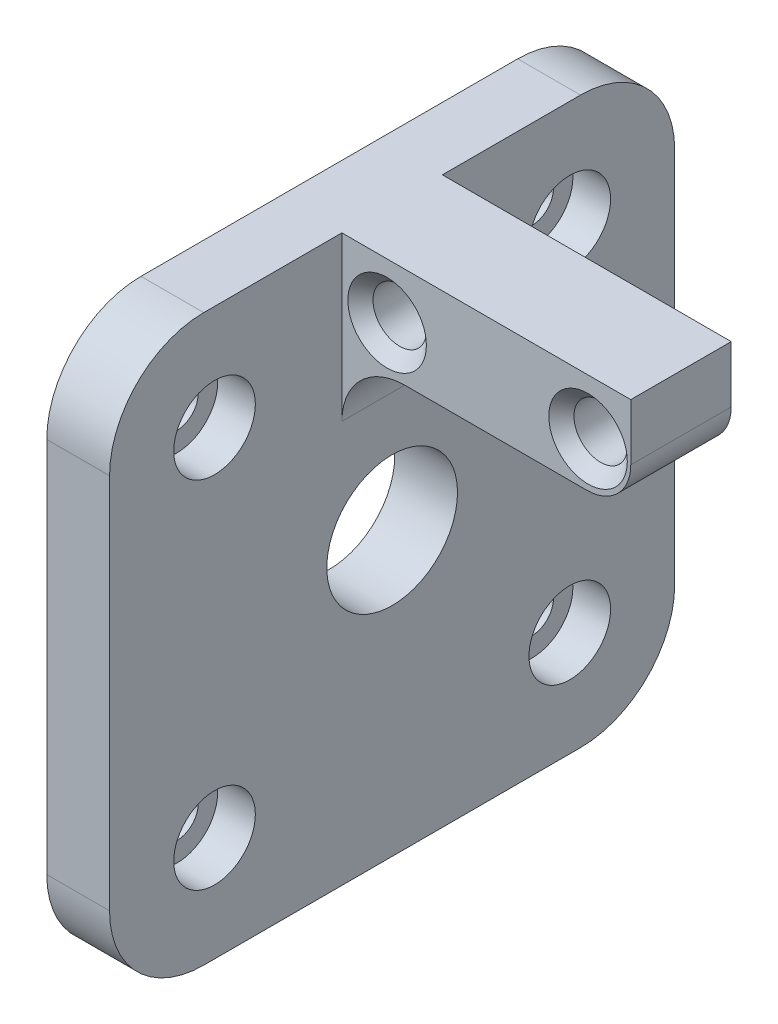
ISO-10303-21;
HEADER;
FILE_DESCRIPTION(('STEP AP214'),'2;1');
FILE_NAME('part.step','',(''),(''),'','','');
FILE_SCHEMA(('AUTOMOTIVE_DESIGN { 1 0 10303 214 1 1 1 1 }'));
ENDSEC;
DATA;
#1=APPLICATION_CONTEXT('core data for automotive mechanical design processes');
#2=APPLICATION_PROTOCOL_DEFINITION('international standard','automotive_design',2000,#1);
#3=PRODUCT_CONTEXT('',#1,'mechanical');
#4=PRODUCT('Part','Part','',(#3));
#5=PRODUCT_RELATED_PRODUCT_CATEGORY('part','',(#4));
#6=PRODUCT_DEFINITION_FORMATION('','',#4);
#7=PRODUCT_DEFINITION_CONTEXT('part definition',#1,'design');
#8=PRODUCT_DEFINITION('design','',#6,#7);
#9=PRODUCT_DEFINITION_SHAPE('','',#8);
#10=(LENGTH_UNIT() NAMED_UNIT(*) SI_UNIT(.MILLI.,.METRE.));
#11=(NAMED_UNIT(*) PLANE_ANGLE_UNIT() SI_UNIT($,.RADIAN.));
#12=(NAMED_UNIT(*) SI_UNIT($,.STERADIAN.) SOLID_ANGLE_UNIT());
#13=UNCERTAINTY_MEASURE_WITH_UNIT(LENGTH_MEASURE(1.E-05),#10,'distance_accuracy_value','');
#14=(GEOMETRIC_REPRESENTATION_CONTEXT(3) GLOBAL_UNCERTAINTY_ASSIGNED_CONTEXT((#13)) GLOBAL_UNIT_ASSIGNED_CONTEXT((#10,
#11,#12)) REPRESENTATION_CONTEXT('',''));
#15=CARTESIAN_POINT('',(0.,0.,0.));
#16=DIRECTION('',(0.,0.,1.));
#17=DIRECTION('',(1.,0.,0.));
#18=AXIS2_PLACEMENT_3D('',#15,#16,#17);
#19=CARTESIAN_POINT('',(5.,22.5,0.));
#20=DIRECTION('',(0.,1.,0.));
#21=DIRECTION('',(0.,0.,1.));
#22=AXIS2_PLACEMENT_3D('',#19,#20,#21);
#23=PLANE('',#22);
#24=DIRECTION('',(0.,0.,-1.));
#25=VECTOR('',#24,1.);
#26=CARTESIAN_POINT('',(5.,22.5,0.));
#27=LINE('',#26,#25);
#28=CARTESIAN_POINT('',(5.,22.5,-4.));
#29=VERTEX_POINT('',#28);
#30=CARTESIAN_POINT('',(5.,22.5,-15.));
#31=VERTEX_POINT('',#30);
#32=EDGE_CURVE('E222',#29,#31,#27,.T.);
#33=ORIENTED_EDGE('',*,*,#32,.T.);
#34=DIRECTION('',(-1.,0.,0.));
#35=VECTOR('',#34,1.);
#36=CARTESIAN_POINT('',(0.,22.5,-15.));
#37=LINE('',#36,#35);
#38=CARTESIAN_POINT('',(0.,22.5,-15.));
#39=VERTEX_POINT('',#38);
#40=EDGE_CURVE('E305',#31,#39,#37,.T.);
#41=ORIENTED_EDGE('',*,*,#40,.T.);
#42=DIRECTION('',(0.,0.,-1.));
#43=VECTOR('',#42,1.);
#44=CARTESIAN_POINT('',(0.,22.5,0.));
#45=LINE('',#44,#43);
#46=CARTESIAN_POINT('',(0.,22.5,15.));
#47=VERTEX_POINT('',#46);
#48=EDGE_CURVE('E217',#47,#39,#45,.T.);
#49=ORIENTED_EDGE('',*,*,#48,.F.);
#50=DIRECTION('',(-1.,0.,0.));
#51=VECTOR('',#50,1.);
#52=CARTESIAN_POINT('',(5.,22.5,15.));
#53=LINE('',#52,#51);
#54=CARTESIAN_POINT('',(5.,22.5,15.));
#55=VERTEX_POINT('',#54);
#56=EDGE_CURVE('E302',#47,#55,#53,.F.);
#57=ORIENTED_EDGE('',*,*,#56,.T.);
#58=CARTESIAN_POINT('',(5.,22.5,4.));
#59=VERTEX_POINT('',#58);
#60=EDGE_CURVE('E218',#55,#59,#27,.T.);
#61=ORIENTED_EDGE('',*,*,#60,.T.);
#62=DIRECTION('',(-1.,0.,0.));
#63=VECTOR('',#62,1.);
#64=CARTESIAN_POINT('',(28.,22.5,4.));
#65=LINE('',#64,#63);
#66=CARTESIAN_POINT('',(28.,22.5,4.));
#67=VERTEX_POINT('',#66);
#68=EDGE_CURVE('E182',#67,#59,#65,.T.);
#69=ORIENTED_EDGE('',*,*,#68,.F.);
#70=DIRECTION('',(0.,0.,-1.));
#71=VECTOR('',#70,1.);
#72=CARTESIAN_POINT('',(28.,22.5,0.));
#73=LINE('',#72,#71);
#74=CARTESIAN_POINT('',(28.,22.5,-4.));
#75=VERTEX_POINT('',#74);
#76=EDGE_CURVE('E189',#67,#75,#73,.T.);
#77=ORIENTED_EDGE('',*,*,#76,.T.);
#78=DIRECTION('',(-1.,0.,0.));
#79=VECTOR('',#78,1.);
#80=CARTESIAN_POINT('',(28.,22.5,-4.));
#81=LINE('',#80,#79);
#82=EDGE_CURVE('E170',#75,#29,#81,.T.);
#83=ORIENTED_EDGE('',*,*,#82,.T.);
#84=EDGE_LOOP('',(#33,#41,#49,#57,#61,#69,#77,#83));
#85=FACE_BOUND('',#84,.T.);
#86=ADVANCED_FACE('F51',(#85),#23,.T.);
#87=CARTESIAN_POINT('',(5.,0.,22.5));
#88=DIRECTION('',(0.,0.,1.));
#89=DIRECTION('',(1.,0.,0.));
#90=AXIS2_PLACEMENT_3D('',#87,#88,#89);
#91=PLANE('',#90);
#92=DIRECTION('',(0.,1.,0.));
#93=VECTOR('',#92,1.);
#94=CARTESIAN_POINT('',(0.,0.,22.5));
#95=LINE('',#94,#93);
#96=CARTESIAN_POINT('',(0.,-15.,22.5));
#97=VERTEX_POINT('',#96);
#98=CARTESIAN_POINT('',(0.,15.,22.5));
#99=VERTEX_POINT('',#98);
#100=EDGE_CURVE('E242',#97,#99,#95,.T.);
#101=ORIENTED_EDGE('',*,*,#100,.F.);
#102=DIRECTION('',(-1.,0.,0.));
#103=VECTOR('',#102,1.);
#104=CARTESIAN_POINT('',(5.,-15.,22.5));
#105=LINE('',#104,#103);
#106=CARTESIAN_POINT('',(5.,-15.,22.5));
#107=VERTEX_POINT('',#106);
#108=EDGE_CURVE('E280',#97,#107,#105,.F.);
#109=ORIENTED_EDGE('',*,*,#108,.T.);
#110=DIRECTION('',(0.,1.,0.));
#111=VECTOR('',#110,1.);
#112=CARTESIAN_POINT('',(5.,0.,22.5));
#113=LINE('',#112,#111);
#114=CARTESIAN_POINT('',(5.,15.,22.5));
#115=VERTEX_POINT('',#114);
#116=EDGE_CURVE('E221',#107,#115,#113,.T.);
#117=ORIENTED_EDGE('',*,*,#116,.T.);
#118=DIRECTION('',(-1.,0.,0.));
#119=VECTOR('',#118,1.);
#120=CARTESIAN_POINT('',(5.,15.,22.5));
#121=LINE('',#120,#119);
#122=EDGE_CURVE('E276',#115,#99,#121,.T.);
#123=ORIENTED_EDGE('',*,*,#122,.T.);
#124=EDGE_LOOP('',(#101,#109,#117,#123));
#125=FACE_BOUND('',#124,.T.);
#126=ADVANCED_FACE('F380',(#125),#91,.T.);
#127=CARTESIAN_POINT('',(5.,-22.5,0.));
#128=DIRECTION('',(0.,1.,0.));
#129=DIRECTION('',(0.,0.,1.));
#130=AXIS2_PLACEMENT_3D('',#127,#128,#129);
#131=PLANE('',#130);
#132=DIRECTION('',(0.,0.,-1.));
#133=VECTOR('',#132,1.);
#134=CARTESIAN_POINT('',(5.,-22.5,0.));
#135=LINE('',#134,#133);
#136=CARTESIAN_POINT('',(5.,-22.5,15.));
#137=VERTEX_POINT('',#136);
#138=CARTESIAN_POINT('',(5.,-22.5,-15.));
#139=VERTEX_POINT('',#138);
#140=EDGE_CURVE('E226',#137,#139,#135,.T.);
#141=ORIENTED_EDGE('',*,*,#140,.F.);
#142=DIRECTION('',(-1.,0.,0.));
#143=VECTOR('',#142,1.);
#144=CARTESIAN_POINT('',(0.,-22.5,15.));
#145=LINE('',#144,#143);
#146=CARTESIAN_POINT('',(0.,-22.5,15.));
#147=VERTEX_POINT('',#146);
#148=EDGE_CURVE('E260',#137,#147,#145,.T.);
#149=ORIENTED_EDGE('',*,*,#148,.T.);
#150=DIRECTION('',(0.,0.,-1.));
#151=VECTOR('',#150,1.);
#152=CARTESIAN_POINT('',(0.,-22.5,0.));
#153=LINE('',#152,#151);
#154=CARTESIAN_POINT('',(0.,-22.5,-15.));
#155=VERTEX_POINT('',#154);
#156=EDGE_CURVE('E246',#147,#155,#153,.T.);
#157=ORIENTED_EDGE('',*,*,#156,.T.);
#158=DIRECTION('',(-1.,0.,0.));
#159=VECTOR('',#158,1.);
#160=CARTESIAN_POINT('',(5.,-22.5,-15.));
#161=LINE('',#160,#159);
#162=EDGE_CURVE('E238',#155,#139,#161,.F.);
#163=ORIENTED_EDGE('',*,*,#162,.T.);
#164=EDGE_LOOP('',(#141,#149,#157,#163));
#165=FACE_BOUND('',#164,.T.);
#166=ADVANCED_FACE('F385',(#165),#131,.F.);
#167=CARTESIAN_POINT('',(5.,0.,-22.5));
#168=DIRECTION('',(0.,0.,1.));
#169=DIRECTION('',(1.,0.,0.));
#170=AXIS2_PLACEMENT_3D('',#167,#168,#169);
#171=PLANE('',#170);
#172=DIRECTION('',(0.,1.,0.));
#173=VECTOR('',#172,1.);
#174=CARTESIAN_POINT('',(5.,0.,-22.5));
#175=LINE('',#174,#173);
#176=CARTESIAN_POINT('',(5.,-15.,-22.5));
#177=VERTEX_POINT('',#176);
#178=CARTESIAN_POINT('',(5.,15.,-22.5));
#179=VERTEX_POINT('',#178);
#180=EDGE_CURVE('E230',#177,#179,#175,.T.);
#181=ORIENTED_EDGE('',*,*,#180,.F.);
#182=DIRECTION('',(-1.,0.,0.));
#183=VECTOR('',#182,1.);
#184=CARTESIAN_POINT('',(5.,-15.,-22.5));
#185=LINE('',#184,#183);
#186=CARTESIAN_POINT('',(0.,-15.,-22.5));
#187=VERTEX_POINT('',#186);
#188=EDGE_CURVE('E298',#177,#187,#185,.T.);
#189=ORIENTED_EDGE('',*,*,#188,.T.);
#190=DIRECTION('',(0.,1.,0.));
#191=VECTOR('',#190,1.);
#192=CARTESIAN_POINT('',(0.,0.,-22.5));
#193=LINE('',#192,#191);
#194=CARTESIAN_POINT('',(0.,15.,-22.5));
#195=VERTEX_POINT('',#194);
#196=EDGE_CURVE('E250',#187,#195,#193,.T.);
#197=ORIENTED_EDGE('',*,*,#196,.T.);
#198=DIRECTION('',(-1.,0.,0.));
#199=VECTOR('',#198,1.);
#200=CARTESIAN_POINT('',(5.,15.,-22.5));
#201=LINE('',#200,#199);
#202=EDGE_CURVE('E295',#195,#179,#201,.F.);
#203=ORIENTED_EDGE('',*,*,#202,.T.);
#204=EDGE_LOOP('',(#181,#189,#197,#203));
#205=FACE_BOUND('',#204,.T.);
#206=ADVANCED_FACE('F426',(#205),#171,.F.);
#207=CARTESIAN_POINT('',(5.,0.,0.));
#208=DIRECTION('',(-1.,0.,0.));
#209=DIRECTION('',(0.,0.,1.));
#210=AXIS2_PLACEMENT_3D('',#207,#208,#209);
#211=CYLINDRICAL_SURFACE('',#210,5.205);
#212=CARTESIAN_POINT('',(5.,0.,0.));
#213=DIRECTION('',(1.,0.,0.));
#214=DIRECTION('',(0.,0.,-1.));
#215=AXIS2_PLACEMENT_3D('',#212,#213,#214);
#216=CIRCLE('',#215,5.205);
#217=CARTESIAN_POINT('',(5.,0.,-5.205));
#218=VERTEX_POINT('',#217);
#219=EDGE_CURVE('E234',#218,#218,#216,.T.);
#220=ORIENTED_EDGE('',*,*,#219,.T.);
#221=EDGE_LOOP('',(#220));
#222=FACE_BOUND('',#221,.T.);
#223=CARTESIAN_POINT('',(0.,0.,0.));
#224=DIRECTION('',(1.,0.,0.));
#225=DIRECTION('',(0.,0.,-1.));
#226=AXIS2_PLACEMENT_3D('',#223,#224,#225);
#227=CIRCLE('',#226,5.205);
#228=CARTESIAN_POINT('',(0.,0.,-5.205));
#229=VERTEX_POINT('',#228);
#230=EDGE_CURVE('E254',#229,#229,#227,.T.);
#231=ORIENTED_EDGE('',*,*,#230,.F.);
#232=EDGE_LOOP('',(#231));
#233=FACE_BOUND('',#232,.T.);
#234=ADVANCED_FACE('F440',(#222,#233),#211,.F.);
#235=CARTESIAN_POINT('',(5.,0.,0.));
#236=DIRECTION('',(1.,0.,0.));
#237=DIRECTION('',(0.,0.,-1.));
#238=AXIS2_PLACEMENT_3D('',#235,#236,#237);
#239=PLANE('',#238);
#240=CARTESIAN_POINT('',(5.,14.142135623731,14.142135623731));
#241=DIRECTION('',(1.,0.,0.));
#242=DIRECTION('',(0.,0.,-1.));
#243=AXIS2_PLACEMENT_3D('',#240,#241,#242);
#244=CIRCLE('',#243,3.25);
#245=CARTESIAN_POINT('',(5.,14.142135623731,10.892135623731));
#246=VERTEX_POINT('',#245);
#247=EDGE_CURVE('E766',#246,#246,#244,.T.);
#248=ORIENTED_EDGE('',*,*,#247,.F.);
#249=EDGE_LOOP('',(#248));
#250=FACE_BOUND('',#249,.T.);
#251=CARTESIAN_POINT('',(5.,14.142135623731,-14.142135623731));
#252=DIRECTION('',(1.,0.,0.));
#253=DIRECTION('',(0.,0.,-1.));
#254=AXIS2_PLACEMENT_3D('',#251,#252,#253);
#255=CIRCLE('',#254,3.25);
#256=CARTESIAN_POINT('',(5.,14.142135623731,-17.392135623731));
#257=VERTEX_POINT('',#256);
#258=EDGE_CURVE('E750',#257,#257,#255,.T.);
#259=ORIENTED_EDGE('',*,*,#258,.F.);
#260=EDGE_LOOP('',(#259));
#261=FACE_BOUND('',#260,.T.);
#262=CARTESIAN_POINT('',(5.,-14.142135623731,14.142135623731));
#263=DIRECTION('',(1.,0.,0.));
#264=DIRECTION('',(0.,0.,-1.));
#265=AXIS2_PLACEMENT_3D('',#262,#263,#264);
#266=CIRCLE('',#265,3.25);
#267=CARTESIAN_POINT('',(5.,-14.142135623731,10.892135623731));
#268=VERTEX_POINT('',#267);
#269=EDGE_CURVE('E734',#268,#268,#266,.T.);
#270=ORIENTED_EDGE('',*,*,#269,.F.);
#271=EDGE_LOOP('',(#270));
#272=FACE_BOUND('',#271,.T.);
#273=CARTESIAN_POINT('',(5.,-14.142135623731,-14.142135623731));
#274=DIRECTION('',(1.,0.,0.));
#275=DIRECTION('',(0.,0.,-1.));
#276=AXIS2_PLACEMENT_3D('',#273,#274,#275);
#277=CIRCLE('',#276,3.25);
#278=CARTESIAN_POINT('',(5.,-14.142135623731,-17.392135623731));
#279=VERTEX_POINT('',#278);
#280=EDGE_CURVE('E718',#279,#279,#277,.T.);
#281=ORIENTED_EDGE('',*,*,#280,.F.);
#282=EDGE_LOOP('',(#281));
#283=FACE_BOUND('',#282,.T.);
#284=DIRECTION('',(0.,0.,1.));
#285=VECTOR('',#284,1.);
#286=CARTESIAN_POINT('',(5.,9.5,0.));
#287=LINE('',#286,#285);
#288=CARTESIAN_POINT('',(5.,9.5,-4.));
#289=VERTEX_POINT('',#288);
#290=CARTESIAN_POINT('',(5.,9.5,4.));
#291=VERTEX_POINT('',#290);
#292=EDGE_CURVE('E309',#289,#291,#287,.T.);
#293=ORIENTED_EDGE('',*,*,#292,.T.);
#294=DIRECTION('',(0.,1.,0.));
#295=VECTOR('',#294,1.);
#296=CARTESIAN_POINT('',(5.,0.,4.00000000000001));
#297=LINE('',#296,#295);
#298=EDGE_CURVE('E181',#291,#59,#297,.T.);
#299=ORIENTED_EDGE('',*,*,#298,.T.);
#300=ORIENTED_EDGE('',*,*,#60,.F.);
#301=CARTESIAN_POINT('',(5.,15.,15.));
#302=DIRECTION('',(1.,0.,0.));
#303=DIRECTION('',(0.,0.,-1.));
#304=AXIS2_PLACEMENT_3D('',#301,#302,#303);
#305=CIRCLE('',#304,7.5);
#306=EDGE_CURVE('E283',#55,#115,#305,.T.);
#307=ORIENTED_EDGE('',*,*,#306,.T.);
#308=ORIENTED_EDGE('',*,*,#116,.F.);
#309=CARTESIAN_POINT('',(5.,-15.,15.));
#310=DIRECTION('',(1.,0.,0.));
#311=DIRECTION('',(0.,0.,-1.));
#312=AXIS2_PLACEMENT_3D('',#309,#310,#311);
#313=CIRCLE('',#312,7.5);
#314=EDGE_CURVE('E292',#107,#137,#313,.T.);
#315=ORIENTED_EDGE('',*,*,#314,.T.);
#316=ORIENTED_EDGE('',*,*,#140,.T.);
#317=CARTESIAN_POINT('',(5.,-15.,-15.));
#318=DIRECTION('',(1.,0.,0.));
#319=DIRECTION('',(0.,0.,-1.));
#320=AXIS2_PLACEMENT_3D('',#317,#318,#319);
#321=CIRCLE('',#320,7.5);
#322=EDGE_CURVE('E289',#139,#177,#321,.T.);
#323=ORIENTED_EDGE('',*,*,#322,.T.);
#324=ORIENTED_EDGE('',*,*,#180,.T.);
#325=CARTESIAN_POINT('',(5.,15.,-15.));
#326=DIRECTION('',(1.,0.,0.));
#327=DIRECTION('',(0.,0.,-1.));
#328=AXIS2_PLACEMENT_3D('',#325,#326,#327);
#329=CIRCLE('',#328,7.5);
#330=EDGE_CURVE('E286',#179,#31,#329,.T.);
#331=ORIENTED_EDGE('',*,*,#330,.T.);
#332=ORIENTED_EDGE('',*,*,#32,.F.);
#333=DIRECTION('',(0.,1.,0.));
#334=VECTOR('',#333,1.);
#335=CARTESIAN_POINT('',(5.,0.,-4.00000000000001));
#336=LINE('',#335,#334);
#337=EDGE_CURVE('E175',#289,#29,#336,.T.);
#338=ORIENTED_EDGE('',*,*,#337,.F.);
#339=EDGE_LOOP('',(#293,#299,#300,#307,#308,#315,#316,#323,#324,#331,#332,#338));
#340=FACE_BOUND('',#339,.T.);
#341=ORIENTED_EDGE('',*,*,#219,.F.);
#342=EDGE_LOOP('',(#341));
#343=FACE_BOUND('',#342,.T.);
#344=ADVANCED_FACE('F411',(#250,#261,#272,#283,#340,#343),#239,.T.);
#345=CARTESIAN_POINT('',(0.,0.,0.));
#346=DIRECTION('',(1.,0.,0.));
#347=DIRECTION('',(0.,0.,-1.));
#348=AXIS2_PLACEMENT_3D('',#345,#346,#347);
#349=PLANE('',#348);
#350=CARTESIAN_POINT('',(0.,14.142135623731,14.142135623731));
#351=DIRECTION('',(1.,0.,0.));
#352=DIRECTION('',(0.,0.,-1.));
#353=AXIS2_PLACEMENT_3D('',#350,#351,#352);
#354=CIRCLE('',#353,1.7);
#355=CARTESIAN_POINT('',(0.,14.142135623731,12.442135623731));
#356=VERTEX_POINT('',#355);
#357=EDGE_CURVE('E754',#356,#356,#354,.T.);
#358=ORIENTED_EDGE('',*,*,#357,.T.);
#359=EDGE_LOOP('',(#358));
#360=FACE_BOUND('',#359,.T.);
#361=CARTESIAN_POINT('',(0.,14.142135623731,-14.142135623731));
#362=DIRECTION('',(1.,0.,0.));
#363=DIRECTION('',(0.,0.,-1.));
#364=AXIS2_PLACEMENT_3D('',#361,#362,#363);
#365=CIRCLE('',#364,1.7);
#366=CARTESIAN_POINT('',(0.,14.142135623731,-15.842135623731));
#367=VERTEX_POINT('',#366);
#368=EDGE_CURVE('E738',#367,#367,#365,.T.);
#369=ORIENTED_EDGE('',*,*,#368,.T.);
#370=EDGE_LOOP('',(#369));
#371=FACE_BOUND('',#370,.T.);
#372=CARTESIAN_POINT('',(0.,-14.142135623731,14.142135623731));
#373=DIRECTION('',(1.,0.,0.));
#374=DIRECTION('',(0.,0.,-1.));
#375=AXIS2_PLACEMENT_3D('',#372,#373,#374);
#376=CIRCLE('',#375,1.7);
#377=CARTESIAN_POINT('',(0.,-14.142135623731,12.442135623731));
#378=VERTEX_POINT('',#377);
#379=EDGE_CURVE('E722',#378,#378,#376,.T.);
#380=ORIENTED_EDGE('',*,*,#379,.T.);
#381=EDGE_LOOP('',(#380));
#382=FACE_BOUND('',#381,.T.);
#383=CARTESIAN_POINT('',(0.,-14.142135623731,-14.142135623731));
#384=DIRECTION('',(1.,0.,0.));
#385=DIRECTION('',(0.,0.,-1.));
#386=AXIS2_PLACEMENT_3D('',#383,#384,#385);
#387=CIRCLE('',#386,1.7);
#388=CARTESIAN_POINT('',(0.,-14.142135623731,-15.8421356237309));
#389=VERTEX_POINT('',#388);
#390=EDGE_CURVE('E704',#389,#389,#387,.T.);
#391=ORIENTED_EDGE('',*,*,#390,.T.);
#392=EDGE_LOOP('',(#391));
#393=FACE_BOUND('',#392,.T.);
#394=ORIENTED_EDGE('',*,*,#156,.F.);
#395=CARTESIAN_POINT('',(0.,-15.,15.));
#396=DIRECTION('',(1.,0.,0.));
#397=DIRECTION('',(0.,0.,-1.));
#398=AXIS2_PLACEMENT_3D('',#395,#396,#397);
#399=CIRCLE('',#398,7.5);
#400=EDGE_CURVE('E273',#147,#97,#399,.F.);
#401=ORIENTED_EDGE('',*,*,#400,.T.);
#402=ORIENTED_EDGE('',*,*,#100,.T.);
#403=CARTESIAN_POINT('',(0.,15.,15.));
#404=DIRECTION('',(1.,0.,0.));
#405=DIRECTION('',(0.,0.,-1.));
#406=AXIS2_PLACEMENT_3D('',#403,#404,#405);
#407=CIRCLE('',#406,7.5);
#408=EDGE_CURVE('E264',#99,#47,#407,.F.);
#409=ORIENTED_EDGE('',*,*,#408,.T.);
#410=ORIENTED_EDGE('',*,*,#48,.T.);
#411=CARTESIAN_POINT('',(0.,15.,-15.));
#412=DIRECTION('',(1.,0.,0.));
#413=DIRECTION('',(0.,0.,-1.));
#414=AXIS2_PLACEMENT_3D('',#411,#412,#413);
#415=CIRCLE('',#414,7.5);
#416=EDGE_CURVE('E267',#39,#195,#415,.F.);
#417=ORIENTED_EDGE('',*,*,#416,.T.);
#418=ORIENTED_EDGE('',*,*,#196,.F.);
#419=CARTESIAN_POINT('',(0.,-15.,-15.));
#420=DIRECTION('',(1.,0.,0.));
#421=DIRECTION('',(0.,0.,-1.));
#422=AXIS2_PLACEMENT_3D('',#419,#420,#421);
#423=CIRCLE('',#422,7.5);
#424=EDGE_CURVE('E270',#187,#155,#423,.F.);
#425=ORIENTED_EDGE('',*,*,#424,.T.);
#426=EDGE_LOOP('',(#394,#401,#402,#409,#410,#417,#418,#425));
#427=FACE_BOUND('',#426,.T.);
#428=ORIENTED_EDGE('',*,*,#230,.T.);
#429=EDGE_LOOP('',(#428));
#430=FACE_BOUND('',#429,.T.);
#431=ADVANCED_FACE('F433',(#360,#371,#382,#393,#427,#430),#349,.F.);
#432=CARTESIAN_POINT('',(28.,0.,-4.00000000000001));
#433=DIRECTION('',(0.,0.,-1.));
#434=DIRECTION('',(0.,1.,0.));
#435=AXIS2_PLACEMENT_3D('',#432,#433,#434);
#436=PLANE('',#435);
#437=CARTESIAN_POINT('',(8.60000000000001,18.1,-4.));
#438=DIRECTION('',(0.,0.,-1.));
#439=DIRECTION('',(0.,1.,0.));
#440=AXIS2_PLACEMENT_3D('',#437,#438,#439);
#441=CIRCLE('',#440,2.125);
#442=CARTESIAN_POINT('',(10.725,18.1,-3.99999999999999));
#443=VERTEX_POINT('',#442);
#444=EDGE_CURVE('E193',#443,#443,#441,.T.);
#445=ORIENTED_EDGE('',*,*,#444,.F.);
#446=EDGE_LOOP('',(#445));
#447=FACE_BOUND('',#446,.T.);
#448=CARTESIAN_POINT('',(24.6,18.1,-4.));
#449=DIRECTION('',(0.,0.,-1.));
#450=DIRECTION('',(0.,1.,0.));
#451=AXIS2_PLACEMENT_3D('',#448,#449,#450);
#452=CIRCLE('',#451,2.125);
#453=CARTESIAN_POINT('',(26.725,18.1,-3.99999999999999));
#454=VERTEX_POINT('',#453);
#455=EDGE_CURVE('E701',#454,#454,#452,.T.);
#456=ORIENTED_EDGE('',*,*,#455,.F.);
#457=EDGE_LOOP('',(#456));
#458=FACE_BOUND('',#457,.T.);
#459=DIRECTION('',(0.,-1.,0.));
#460=VECTOR('',#459,1.);
#461=CARTESIAN_POINT('',(28.,0.,-4.00000000000001));
#462=LINE('',#461,#460);
#463=CARTESIAN_POINT('',(28.,18.,-4.));
#464=VERTEX_POINT('',#463);
#465=EDGE_CURVE('E173',#75,#464,#462,.T.);
#466=ORIENTED_EDGE('',*,*,#465,.T.);
#467=CARTESIAN_POINT('',(24.5,18.,-4.));
#468=DIRECTION('',(0.,0.,-1.));
#469=DIRECTION('',(0.,1.,0.));
#470=AXIS2_PLACEMENT_3D('',#467,#468,#469);
#471=CIRCLE('',#470,3.5);
#472=CARTESIAN_POINT('',(24.5,14.5,-4.));
#473=VERTEX_POINT('',#472);
#474=EDGE_CURVE('E79',#464,#473,#471,.T.);
#475=ORIENTED_EDGE('',*,*,#474,.T.);
#476=DIRECTION('',(-1.,0.,0.));
#477=VECTOR('',#476,1.);
#478=CARTESIAN_POINT('',(28.,14.5,-4.));
#479=LINE('',#478,#477);
#480=CARTESIAN_POINT('',(9.99999999999999,14.5,-4.));
#481=VERTEX_POINT('',#480);
#482=EDGE_CURVE('E201',#473,#481,#479,.T.);
#483=ORIENTED_EDGE('',*,*,#482,.T.);
#484=CARTESIAN_POINT('',(10.,9.5,-4.));
#485=DIRECTION('',(0.,0.,-1.));
#486=DIRECTION('',(0.,1.,0.));
#487=AXIS2_PLACEMENT_3D('',#484,#485,#486);
#488=CIRCLE('',#487,5.);
#489=EDGE_CURVE('E321',#481,#289,#488,.F.);
#490=ORIENTED_EDGE('',*,*,#489,.T.);
#491=ORIENTED_EDGE('',*,*,#337,.T.);
#492=ORIENTED_EDGE('',*,*,#82,.F.);
#493=EDGE_LOOP('',(#466,#475,#483,#490,#491,#492));
#494=FACE_BOUND('',#493,.T.);
#495=ADVANCED_FACE('F172',(#447,#458,#494),#436,.T.);
#496=CARTESIAN_POINT('',(28.,0.,4.00000000000001));
#497=DIRECTION('',(0.,0.,-1.));
#498=DIRECTION('',(0.,1.,0.));
#499=AXIS2_PLACEMENT_3D('',#496,#497,#498);
#500=PLANE('',#499);
#501=CARTESIAN_POINT('',(24.6,18.1,4.));
#502=DIRECTION('',(0.,0.,-1.));
#503=DIRECTION('',(0.,1.,0.));
#504=AXIS2_PLACEMENT_3D('',#501,#502,#503);
#505=CIRCLE('',#504,3.12499999999996);
#506=CARTESIAN_POINT('',(24.6,21.2249999999999,4.));
#507=VERTEX_POINT('',#506);
#508=EDGE_CURVE('E337',#507,#507,#505,.T.);
#509=ORIENTED_EDGE('',*,*,#508,.T.);
#510=EDGE_LOOP('',(#509));
#511=FACE_BOUND('',#510,.T.);
#512=CARTESIAN_POINT('',(8.60000000000001,18.1,4.));
#513=DIRECTION('',(0.,0.,-1.));
#514=DIRECTION('',(0.,1.,0.));
#515=AXIS2_PLACEMENT_3D('',#512,#513,#514);
#516=CIRCLE('',#515,3.12499999999996);
#517=CARTESIAN_POINT('',(8.60000000000001,21.225,4.));
#518=VERTEX_POINT('',#517);
#519=EDGE_CURVE('E333',#518,#518,#516,.T.);
#520=ORIENTED_EDGE('',*,*,#519,.T.);
#521=EDGE_LOOP('',(#520));
#522=FACE_BOUND('',#521,.T.);
#523=DIRECTION('',(-1.,0.,0.));
#524=VECTOR('',#523,1.);
#525=CARTESIAN_POINT('',(28.,14.5,4.));
#526=LINE('',#525,#524);
#527=CARTESIAN_POINT('',(24.5,14.5,4.));
#528=VERTEX_POINT('',#527);
#529=CARTESIAN_POINT('',(9.99999999999999,14.5,4.));
#530=VERTEX_POINT('',#529);
#531=EDGE_CURVE('E207',#528,#530,#526,.T.);
#532=ORIENTED_EDGE('',*,*,#531,.F.);
#533=CARTESIAN_POINT('',(24.5,18.,4.));
#534=DIRECTION('',(0.,0.,-1.));
#535=DIRECTION('',(0.,1.,0.));
#536=AXIS2_PLACEMENT_3D('',#533,#534,#535);
#537=CIRCLE('',#536,3.5);
#538=CARTESIAN_POINT('',(28.,18.,4.));
#539=VERTEX_POINT('',#538);
#540=EDGE_CURVE('E330',#528,#539,#537,.F.);
#541=ORIENTED_EDGE('',*,*,#540,.T.);
#542=DIRECTION('',(0.,-1.,0.));
#543=VECTOR('',#542,1.);
#544=CARTESIAN_POINT('',(28.,0.,4.00000000000001));
#545=LINE('',#544,#543);
#546=EDGE_CURVE('E198',#67,#539,#545,.T.);
#547=ORIENTED_EDGE('',*,*,#546,.F.);
#548=ORIENTED_EDGE('',*,*,#68,.T.);
#549=ORIENTED_EDGE('',*,*,#298,.F.);
#550=CARTESIAN_POINT('',(10.,9.5,4.));
#551=DIRECTION('',(0.,0.,-1.));
#552=DIRECTION('',(0.,1.,0.));
#553=AXIS2_PLACEMENT_3D('',#550,#551,#552);
#554=CIRCLE('',#553,5.);
#555=EDGE_CURVE('E317',#291,#530,#554,.T.);
#556=ORIENTED_EDGE('',*,*,#555,.T.);
#557=EDGE_LOOP('',(#532,#541,#547,#548,#549,#556));
#558=FACE_BOUND('',#557,.T.);
#559=ADVANCED_FACE('F353',(#511,#522,#558),#500,.F.);
#560=CARTESIAN_POINT('',(28.,14.5,0.));
#561=DIRECTION('',(0.,1.,0.));
#562=DIRECTION('',(0.,0.,1.));
#563=AXIS2_PLACEMENT_3D('',#560,#561,#562);
#564=PLANE('',#563);
#565=ORIENTED_EDGE('',*,*,#482,.F.);
#566=DIRECTION('',(0.,0.,-1.));
#567=VECTOR('',#566,1.);
#568=CARTESIAN_POINT('',(24.5,14.5,4.));
#569=LINE('',#568,#567);
#570=EDGE_CURVE('E71',#473,#528,#569,.F.);
#571=ORIENTED_EDGE('',*,*,#570,.T.);
#572=ORIENTED_EDGE('',*,*,#531,.T.);
#573=DIRECTION('',(0.,0.,1.));
#574=VECTOR('',#573,1.);
#575=CARTESIAN_POINT('',(9.99999999999999,14.5,0.));
#576=LINE('',#575,#574);
#577=EDGE_CURVE('E313',#530,#481,#576,.F.);
#578=ORIENTED_EDGE('',*,*,#577,.T.);
#579=EDGE_LOOP('',(#565,#571,#572,#578));
#580=FACE_BOUND('',#579,.T.);
#581=ADVANCED_FACE('F356',(#580),#564,.F.);
#582=CARTESIAN_POINT('',(28.,0.,0.));
#583=DIRECTION('',(1.,0.,0.));
#584=DIRECTION('',(0.,0.,-1.));
#585=AXIS2_PLACEMENT_3D('',#582,#583,#584);
#586=PLANE('',#585);
#587=ORIENTED_EDGE('',*,*,#546,.T.);
#588=DIRECTION('',(0.,0.,-1.));
#589=VECTOR('',#588,1.);
#590=CARTESIAN_POINT('',(28.,18.,-4.));
#591=LINE('',#590,#589);
#592=EDGE_CURVE('E191',#539,#464,#591,.T.);
#593=ORIENTED_EDGE('',*,*,#592,.T.);
#594=ORIENTED_EDGE('',*,*,#465,.F.);
#595=ORIENTED_EDGE('',*,*,#76,.F.);
#596=EDGE_LOOP('',(#587,#593,#594,#595));
#597=FACE_BOUND('',#596,.T.);
#598=ADVANCED_FACE('F188',(#597),#586,.T.);
#599=CARTESIAN_POINT('',(5.,-15.,15.));
#600=DIRECTION('',(1.,0.,0.));
#601=DIRECTION('',(0.,0.,-1.));
#602=AXIS2_PLACEMENT_3D('',#599,#600,#601);
#603=CYLINDRICAL_SURFACE('',#602,7.5);
#604=ORIENTED_EDGE('',*,*,#314,.F.);
#605=ORIENTED_EDGE('',*,*,#108,.F.);
#606=ORIENTED_EDGE('',*,*,#400,.F.);
#607=ORIENTED_EDGE('',*,*,#148,.F.);
#608=EDGE_LOOP('',(#604,#605,#606,#607));
#609=FACE_BOUND('',#608,.T.);
#610=ADVANCED_FACE('F390',(#609),#603,.T.);
#611=CARTESIAN_POINT('',(5.,-15.,-15.));
#612=DIRECTION('',(-1.,0.,0.));
#613=DIRECTION('',(0.,0.,1.));
#614=AXIS2_PLACEMENT_3D('',#611,#612,#613);
#615=CYLINDRICAL_SURFACE('',#614,7.5);
#616=ORIENTED_EDGE('',*,*,#322,.F.);
#617=ORIENTED_EDGE('',*,*,#162,.F.);
#618=ORIENTED_EDGE('',*,*,#424,.F.);
#619=ORIENTED_EDGE('',*,*,#188,.F.);
#620=EDGE_LOOP('',(#616,#617,#618,#619));
#621=FACE_BOUND('',#620,.T.);
#622=ADVANCED_FACE('F393',(#621),#615,.T.);
#623=CARTESIAN_POINT('',(5.,15.,-15.));
#624=DIRECTION('',(1.,0.,0.));
#625=DIRECTION('',(0.,0.,-1.));
#626=AXIS2_PLACEMENT_3D('',#623,#624,#625);
#627=CYLINDRICAL_SURFACE('',#626,7.5);
#628=ORIENTED_EDGE('',*,*,#330,.F.);
#629=ORIENTED_EDGE('',*,*,#202,.F.);
#630=ORIENTED_EDGE('',*,*,#416,.F.);
#631=ORIENTED_EDGE('',*,*,#40,.F.);
#632=EDGE_LOOP('',(#628,#629,#630,#631));
#633=FACE_BOUND('',#632,.T.);
#634=ADVANCED_FACE('F397',(#633),#627,.T.);
#635=CARTESIAN_POINT('',(5.,15.,15.));
#636=DIRECTION('',(-1.,0.,0.));
#637=DIRECTION('',(0.,0.,1.));
#638=AXIS2_PLACEMENT_3D('',#635,#636,#637);
#639=CYLINDRICAL_SURFACE('',#638,7.5);
#640=ORIENTED_EDGE('',*,*,#306,.F.);
#641=ORIENTED_EDGE('',*,*,#56,.F.);
#642=ORIENTED_EDGE('',*,*,#408,.F.);
#643=ORIENTED_EDGE('',*,*,#122,.F.);
#644=EDGE_LOOP('',(#640,#641,#642,#643));
#645=FACE_BOUND('',#644,.T.);
#646=ADVANCED_FACE('F376',(#645),#639,.T.);
#647=CARTESIAN_POINT('',(10.,9.5,0.));
#648=DIRECTION('',(0.,0.,1.));
#649=DIRECTION('',(1.,0.,0.));
#650=AXIS2_PLACEMENT_3D('',#647,#648,#649);
#651=CYLINDRICAL_SURFACE('',#650,5.);
#652=ORIENTED_EDGE('',*,*,#489,.F.);
#653=ORIENTED_EDGE('',*,*,#577,.F.);
#654=ORIENTED_EDGE('',*,*,#555,.F.);
#655=ORIENTED_EDGE('',*,*,#292,.F.);
#656=EDGE_LOOP('',(#652,#653,#654,#655));
#657=FACE_BOUND('',#656,.T.);
#658=ADVANCED_FACE('F366',(#657),#651,.F.);
#659=CARTESIAN_POINT('',(24.5,18.,0.));
#660=DIRECTION('',(0.,0.,1.));
#661=DIRECTION('',(1.,0.,0.));
#662=AXIS2_PLACEMENT_3D('',#659,#660,#661);
#663=CYLINDRICAL_SURFACE('',#662,3.5);
#664=ORIENTED_EDGE('',*,*,#540,.F.);
#665=ORIENTED_EDGE('',*,*,#570,.F.);
#666=ORIENTED_EDGE('',*,*,#474,.F.);
#667=ORIENTED_EDGE('',*,*,#592,.F.);
#668=EDGE_LOOP('',(#664,#665,#666,#667));
#669=FACE_BOUND('',#668,.T.);
#670=ADVANCED_FACE('F364',(#669),#663,.T.);
#671=CARTESIAN_POINT('',(24.6,18.1,-22.5));
#672=DIRECTION('',(0.,0.,1.));
#673=DIRECTION('',(1.,0.,0.));
#674=AXIS2_PLACEMENT_3D('',#671,#672,#673);
#675=CYLINDRICAL_SURFACE('',#674,2.125);
#676=CARTESIAN_POINT('',(24.6,18.1,3.00000000000004));
#677=DIRECTION('',(0.,0.,-1.));
#678=DIRECTION('',(-1.,0.,0.));
#679=AXIS2_PLACEMENT_3D('',#676,#677,#678);
#680=CIRCLE('',#679,2.125);
#681=CARTESIAN_POINT('',(26.725,18.1,3.00000000000004));
#682=VERTEX_POINT('',#681);
#683=EDGE_CURVE('E61',#682,#682,#680,.F.);
#684=CARTESIAN_POINT('',(26.725,18.1,3.00000000000004));
#685=CARTESIAN_POINT('',(26.725,18.1,2.92708333333337));
#686=CARTESIAN_POINT('',(26.725,18.1,2.85416666666671));
#687=CARTESIAN_POINT('',(26.725,18.1,2.70833333333337));
#688=CARTESIAN_POINT('',(26.725,18.1,2.63541666666671));
#689=CARTESIAN_POINT('',(26.725,18.1,2.48958333333337));
#690=CARTESIAN_POINT('',(26.725,18.1,2.4166666666667));
#691=CARTESIAN_POINT('',(26.725,18.1,2.27083333333337));
#692=CARTESIAN_POINT('',(26.725,18.1,2.1979166666667));
#693=CARTESIAN_POINT('',(26.725,18.1,2.05208333333337));
#694=CARTESIAN_POINT('',(26.725,18.1,1.9791666666667));
#695=CARTESIAN_POINT('',(26.725,18.1,1.83333333333337));
#696=CARTESIAN_POINT('',(26.725,18.1,1.7604166666667));
#697=CARTESIAN_POINT('',(26.725,18.1,1.61458333333337));
#698=CARTESIAN_POINT('',(26.725,18.1,1.5416666666667));
#699=CARTESIAN_POINT('',(26.725,18.1,1.39583333333337));
#700=CARTESIAN_POINT('',(26.725,18.1,1.3229166666667));
#701=CARTESIAN_POINT('',(26.725,18.1,1.17708333333337));
#702=CARTESIAN_POINT('',(26.725,18.1,1.1041666666667));
#703=CARTESIAN_POINT('',(26.725,18.1,0.958333333333365));
#704=CARTESIAN_POINT('',(26.725,18.1,0.885416666666699));
#705=CARTESIAN_POINT('',(26.725,18.1,0.739583333333364));
#706=CARTESIAN_POINT('',(26.725,18.1,0.666666666666696));
#707=CARTESIAN_POINT('',(26.725,18.1,0.520833333333362));
#708=CARTESIAN_POINT('',(26.725,18.1,0.447916666666695));
#709=CARTESIAN_POINT('',(26.725,18.1,0.302083333333361));
#710=CARTESIAN_POINT('',(26.725,18.1,0.229166666666695));
#711=CARTESIAN_POINT('',(26.725,18.1,0.08333333333336));
#712=CARTESIAN_POINT('',(26.725,18.1,0.0104166666666921));
#713=CARTESIAN_POINT('',(26.725,18.1,-0.135416666666642));
#714=CARTESIAN_POINT('',(26.725,18.1,-0.208333333333309));
#715=CARTESIAN_POINT('',(26.725,18.1,-0.354166666666643));
#716=CARTESIAN_POINT('',(26.725,18.1,-0.427083333333309));
#717=CARTESIAN_POINT('',(26.725,18.1,-0.572916666666643));
#718=CARTESIAN_POINT('',(26.725,18.1,-0.64583333333331));
#719=CARTESIAN_POINT('',(26.725,18.1,-0.791666666666643));
#720=CARTESIAN_POINT('',(26.725,18.1,-0.86458333333331));
#721=CARTESIAN_POINT('',(26.725,18.1,-1.01041666666664));
#722=CARTESIAN_POINT('',(26.725,18.1,-1.08333333333331));
#723=CARTESIAN_POINT('',(26.725,18.1,-1.22916666666665));
#724=CARTESIAN_POINT('',(26.725,18.1,-1.30208333333331));
#725=CARTESIAN_POINT('',(26.725,18.1,-1.44791666666665));
#726=CARTESIAN_POINT('',(26.725,18.1,-1.52083333333331));
#727=CARTESIAN_POINT('',(26.725,18.1,-1.66666666666665));
#728=CARTESIAN_POINT('',(26.725,18.1,-1.73958333333332));
#729=CARTESIAN_POINT('',(26.725,18.1,-1.88541666666665));
#730=CARTESIAN_POINT('',(26.725,18.1,-1.95833333333332));
#731=CARTESIAN_POINT('',(26.725,18.1,-2.10416666666665));
#732=CARTESIAN_POINT('',(26.725,18.1,-2.17708333333332));
#733=CARTESIAN_POINT('',(26.725,18.1,-2.32291666666665));
#734=CARTESIAN_POINT('',(26.725,18.1,-2.39583333333332));
#735=CARTESIAN_POINT('',(26.725,18.1,-2.54166666666665));
#736=CARTESIAN_POINT('',(26.725,18.1,-2.61458333333332));
#737=CARTESIAN_POINT('',(26.725,18.1,-2.76041666666665));
#738=CARTESIAN_POINT('',(26.725,18.1,-2.83333333333332));
#739=CARTESIAN_POINT('',(26.725,18.1,-2.97916666666666));
#740=CARTESIAN_POINT('',(26.725,18.1,-3.05208333333332));
#741=CARTESIAN_POINT('',(26.725,18.1,-3.19791666666666));
#742=CARTESIAN_POINT('',(26.725,18.1,-3.27083333333332));
#743=CARTESIAN_POINT('',(26.725,18.1,-3.41666666666666));
#744=CARTESIAN_POINT('',(26.725,18.1,-3.48958333333333));
#745=CARTESIAN_POINT('',(26.725,18.1,-3.63541666666666));
#746=CARTESIAN_POINT('',(26.725,18.1,-3.70833333333333));
#747=CARTESIAN_POINT('',(26.725,18.1,-3.85416666666666));
#748=CARTESIAN_POINT('',(26.725,18.1,-3.92708333333333));
#749=CARTESIAN_POINT('',(26.725,18.1,-3.99999999999999));
#750=B_SPLINE_CURVE_WITH_KNOTS('',3,(#684,#685,#686,#687,#688,#689,#690,#691,#692,#693,#694,
#695,#696,#697,#698,#699,#700,#701,#702,#703,#704,#705,#706,#707,#708,#709,#710,#711,#712,#713,
#714,#715,#716,#717,#718,#719,#720,#721,#722,#723,#724,#725,#726,#727,#728,#729,#730,#731,#732,
#733,#734,#735,#736,#737,#738,#739,#740,#741,#742,#743,#744,#745,#746,#747,#748,#749),
.UNSPECIFIED.,.F.,.F.,(4,2,2,2,2,2,2,2,2,2,2,2,2,2,2,2,2,2,2,2,2,2,2,2,2,2,2,2,2,2,2,2,4),(0.,
0.21875,0.4375,0.656250000000004,0.875000000000004,1.09375,1.31250000000001,1.53125000000001,
1.75000000000001,1.96875000000001,2.18750000000001,2.40625000000001,2.62500000000001,
2.84375000000001,3.06250000000002,3.28125000000002,3.50000000000002,3.71875000000002,
3.93750000000002,4.15625000000002,4.37500000000002,4.59375000000002,4.81250000000002,
5.03125000000002,5.25000000000003,5.46875000000003,5.68750000000003,5.90625000000003,
6.12500000000003,6.34375000000003,6.56250000000003,6.78125000000003,7.00000000000003),.UNSPECIFIED.);
#751=EDGE_CURVE('BSEAM344',#682,#454,#750,.T.);
#752=ORIENTED_EDGE('',*,*,#683,.T.);
#753=ORIENTED_EDGE('',*,*,#455,.T.);
#754=ORIENTED_EDGE('',*,*,#751,.T.);
#755=ORIENTED_EDGE('',*,*,#751,.F.);
#756=EDGE_LOOP('',(#752,#754,#753,#755));
#757=FACE_BOUND('',#756,.T.);
#758=ADVANCED_FACE('F344',(#757),#675,.F.);
#759=CARTESIAN_POINT('',(8.60000000000001,18.1,-22.5));
#760=DIRECTION('',(0.,0.,1.));
#761=DIRECTION('',(1.,0.,0.));
#762=AXIS2_PLACEMENT_3D('',#759,#760,#761);
#763=CYLINDRICAL_SURFACE('',#762,2.125);
#764=CARTESIAN_POINT('',(8.60000000000001,18.1,3.00000000000003));
#765=DIRECTION('',(0.,0.,-1.));
#766=DIRECTION('',(-1.,0.,0.));
#767=AXIS2_PLACEMENT_3D('',#764,#765,#766);
#768=CIRCLE('',#767,2.125);
#769=CARTESIAN_POINT('',(10.725,18.1,3.00000000000003));
#770=VERTEX_POINT('',#769);
#771=EDGE_CURVE('E11',#770,#770,#768,.F.);
#772=CARTESIAN_POINT('',(10.725,18.1,3.00000000000003));
#773=CARTESIAN_POINT('',(10.725,18.1,2.92708333333337));
#774=CARTESIAN_POINT('',(10.725,18.1,2.8541666666667));
#775=CARTESIAN_POINT('',(10.725,18.1,2.70833333333337));
#776=CARTESIAN_POINT('',(10.725,18.1,2.6354166666667));
#777=CARTESIAN_POINT('',(10.725,18.1,2.48958333333337));
#778=CARTESIAN_POINT('',(10.725,18.1,2.4166666666667));
#779=CARTESIAN_POINT('',(10.725,18.1,2.27083333333336));
#780=CARTESIAN_POINT('',(10.725,18.1,2.1979166666667));
#781=CARTESIAN_POINT('',(10.725,18.1,2.05208333333336));
#782=CARTESIAN_POINT('',(10.725,18.1,1.9791666666667));
#783=CARTESIAN_POINT('',(10.725,18.1,1.83333333333336));
#784=CARTESIAN_POINT('',(10.725,18.1,1.7604166666667));
#785=CARTESIAN_POINT('',(10.725,18.1,1.61458333333336));
#786=CARTESIAN_POINT('',(10.725,18.1,1.5416666666667));
#787=CARTESIAN_POINT('',(10.725,18.1,1.39583333333336));
#788=CARTESIAN_POINT('',(10.725,18.1,1.32291666666669));
#789=CARTESIAN_POINT('',(10.725,18.1,1.17708333333336));
#790=CARTESIAN_POINT('',(10.725,18.1,1.10416666666669));
#791=CARTESIAN_POINT('',(10.725,18.1,0.958333333333359));
#792=CARTESIAN_POINT('',(10.725,18.1,0.885416666666692));
#793=CARTESIAN_POINT('',(10.725,18.1,0.739583333333358));
#794=CARTESIAN_POINT('',(10.725,18.1,0.666666666666692));
#795=CARTESIAN_POINT('',(10.725,18.1,0.520833333333358));
#796=CARTESIAN_POINT('',(10.725,18.1,0.447916666666691));
#797=CARTESIAN_POINT('',(10.725,18.1,0.302083333333357));
#798=CARTESIAN_POINT('',(10.725,18.1,0.229166666666689));
#799=CARTESIAN_POINT('',(10.725,18.1,0.0833333333333542));
#800=CARTESIAN_POINT('',(10.725,18.1,0.0104166666666875));
#801=CARTESIAN_POINT('',(10.725,18.1,-0.135416666666646));
#802=CARTESIAN_POINT('',(10.725,18.1,-0.208333333333313));
#803=CARTESIAN_POINT('',(10.725,18.1,-0.354166666666646));
#804=CARTESIAN_POINT('',(10.725,18.1,-0.427083333333313));
#805=CARTESIAN_POINT('',(10.725,18.1,-0.572916666666646));
#806=CARTESIAN_POINT('',(10.725,18.1,-0.645833333333313));
#807=CARTESIAN_POINT('',(10.725,18.1,-0.791666666666648));
#808=CARTESIAN_POINT('',(10.725,18.1,-0.864583333333316));
#809=CARTESIAN_POINT('',(10.725,18.1,-1.01041666666665));
#810=CARTESIAN_POINT('',(10.725,18.1,-1.08333333333331));
#811=CARTESIAN_POINT('',(10.725,18.1,-1.22916666666665));
#812=CARTESIAN_POINT('',(10.725,18.1,-1.30208333333332));
#813=CARTESIAN_POINT('',(10.725,18.1,-1.44791666666665));
#814=CARTESIAN_POINT('',(10.725,18.1,-1.52083333333332));
#815=CARTESIAN_POINT('',(10.725,18.1,-1.66666666666665));
#816=CARTESIAN_POINT('',(10.725,18.1,-1.73958333333332));
#817=CARTESIAN_POINT('',(10.725,18.1,-1.88541666666665));
#818=CARTESIAN_POINT('',(10.725,18.1,-1.95833333333332));
#819=CARTESIAN_POINT('',(10.725,18.1,-2.10416666666665));
#820=CARTESIAN_POINT('',(10.725,18.1,-2.17708333333332));
#821=CARTESIAN_POINT('',(10.725,18.1,-2.32291666666665));
#822=CARTESIAN_POINT('',(10.725,18.1,-2.39583333333332));
#823=CARTESIAN_POINT('',(10.725,18.1,-2.54166666666665));
#824=CARTESIAN_POINT('',(10.725,18.1,-2.61458333333332));
#825=CARTESIAN_POINT('',(10.725,18.1,-2.76041666666666));
#826=CARTESIAN_POINT('',(10.725,18.1,-2.83333333333332));
#827=CARTESIAN_POINT('',(10.725,18.1,-2.97916666666666));
#828=CARTESIAN_POINT('',(10.725,18.1,-3.05208333333332));
#829=CARTESIAN_POINT('',(10.725,18.1,-3.19791666666666));
#830=CARTESIAN_POINT('',(10.725,18.1,-3.27083333333332));
#831=CARTESIAN_POINT('',(10.725,18.1,-3.41666666666666));
#832=CARTESIAN_POINT('',(10.725,18.1,-3.48958333333333));
#833=CARTESIAN_POINT('',(10.725,18.1,-3.63541666666666));
#834=CARTESIAN_POINT('',(10.725,18.1,-3.70833333333333));
#835=CARTESIAN_POINT('',(10.725,18.1,-3.85416666666666));
#836=CARTESIAN_POINT('',(10.725,18.1,-3.92708333333333));
#837=CARTESIAN_POINT('',(10.725,18.1,-3.99999999999999));
#838=B_SPLINE_CURVE_WITH_KNOTS('',3,(#772,#773,#774,#775,#776,#777,#778,#779,#780,#781,#782,
#783,#784,#785,#786,#787,#788,#789,#790,#791,#792,#793,#794,#795,#796,#797,#798,#799,#800,#801,
#802,#803,#804,#805,#806,#807,#808,#809,#810,#811,#812,#813,#814,#815,#816,#817,#818,#819,#820,
#821,#822,#823,#824,#825,#826,#827,#828,#829,#830,#831,#832,#833,#834,#835,#836,#837),
.UNSPECIFIED.,.F.,.F.,(4,2,2,2,2,2,2,2,2,2,2,2,2,2,2,2,2,2,2,2,2,2,2,2,2,2,2,2,2,2,2,2,4),(0.,
0.21875,0.4375,0.656250000000004,0.875000000000004,1.09375,1.3125,1.53125,1.75000000000001,
1.96875000000001,2.18750000000001,2.40625000000001,2.62500000000001,2.84375000000001,
3.06250000000001,3.28125000000001,3.50000000000001,3.71875000000001,3.93750000000002,
4.15625000000001,4.37500000000002,4.59375000000002,4.81250000000002,5.03125000000002,
5.25000000000002,5.46875000000002,5.68750000000002,5.90625000000002,6.12500000000002,
6.34375000000002,6.56250000000003,6.78125000000003,7.00000000000003),.UNSPECIFIED.);
#839=EDGE_CURVE('BSEAM373',#770,#443,#838,.T.);
#840=ORIENTED_EDGE('',*,*,#771,.T.);
#841=ORIENTED_EDGE('',*,*,#444,.T.);
#842=ORIENTED_EDGE('',*,*,#839,.T.);
#843=ORIENTED_EDGE('',*,*,#839,.F.);
#844=EDGE_LOOP('',(#840,#842,#841,#843));
#845=FACE_BOUND('',#844,.T.);
#846=ADVANCED_FACE('F373',(#845),#763,.F.);
#847=CARTESIAN_POINT('',(5.,-14.142135623731,-14.142135623731));
#848=DIRECTION('',(1.,0.,0.));
#849=DIRECTION('',(0.,0.,-1.));
#850=AXIS2_PLACEMENT_3D('',#847,#848,#849);
#851=CYLINDRICAL_SURFACE('',#850,1.7);
#852=ORIENTED_EDGE('',*,*,#390,.F.);
#853=EDGE_LOOP('',(#852));
#854=FACE_BOUND('',#853,.T.);
#855=CARTESIAN_POINT('',(2.,-14.142135623731,-14.142135623731));
#856=DIRECTION('',(1.,0.,0.));
#857=DIRECTION('',(0.,0.,-1.));
#858=AXIS2_PLACEMENT_3D('',#855,#856,#857);
#859=CIRCLE('',#858,1.7);
#860=CARTESIAN_POINT('',(2.,-14.142135623731,-15.842135623731));
#861=VERTEX_POINT('',#860);
#862=EDGE_CURVE('E710',#861,#861,#859,.T.);
#863=ORIENTED_EDGE('',*,*,#862,.T.);
#864=EDGE_LOOP('',(#863));
#865=FACE_BOUND('',#864,.T.);
#866=ADVANCED_FACE('F648',(#854,#865),#851,.F.);
#867=CARTESIAN_POINT('',(2.,-12.442135623731,-14.142135623731));
#868=DIRECTION('',(-1.,0.,0.));
#869=DIRECTION('',(0.,0.,1.));
#870=AXIS2_PLACEMENT_3D('',#867,#868,#869);
#871=PLANE('',#870);
#872=ORIENTED_EDGE('',*,*,#862,.F.);
#873=EDGE_LOOP('',(#872));
#874=FACE_BOUND('',#873,.T.);
#875=CARTESIAN_POINT('',(2.,-14.142135623731,-14.142135623731));
#876=DIRECTION('',(1.,0.,0.));
#877=DIRECTION('',(0.,0.,-1.));
#878=AXIS2_PLACEMENT_3D('',#875,#876,#877);
#879=CIRCLE('',#878,3.25);
#880=CARTESIAN_POINT('',(2.,-14.142135623731,-17.392135623731));
#881=VERTEX_POINT('',#880);
#882=EDGE_CURVE('E714',#881,#881,#879,.T.);
#883=ORIENTED_EDGE('',*,*,#882,.T.);
#884=EDGE_LOOP('',(#883));
#885=FACE_BOUND('',#884,.T.);
#886=ADVANCED_FACE('F639',(#874,#885),#871,.F.);
#887=CARTESIAN_POINT('',(5.,-14.142135623731,-14.142135623731));
#888=DIRECTION('',(1.,0.,0.));
#889=DIRECTION('',(0.,0.,-1.));
#890=AXIS2_PLACEMENT_3D('',#887,#888,#889);
#891=CYLINDRICAL_SURFACE('',#890,3.25);
#892=ORIENTED_EDGE('',*,*,#882,.F.);
#893=EDGE_LOOP('',(#892));
#894=FACE_BOUND('',#893,.T.);
#895=ORIENTED_EDGE('',*,*,#280,.T.);
#896=EDGE_LOOP('',(#895));
#897=FACE_BOUND('',#896,.T.);
#898=ADVANCED_FACE('F630',(#894,#897),#891,.F.);
#899=CARTESIAN_POINT('',(5.,-14.142135623731,14.142135623731));
#900=DIRECTION('',(1.,0.,0.));
#901=DIRECTION('',(0.,0.,-1.));
#902=AXIS2_PLACEMENT_3D('',#899,#900,#901);
#903=CYLINDRICAL_SURFACE('',#902,1.7);
#904=ORIENTED_EDGE('',*,*,#379,.F.);
#905=EDGE_LOOP('',(#904));
#906=FACE_BOUND('',#905,.T.);
#907=CARTESIAN_POINT('',(2.,-14.142135623731,14.142135623731));
#908=DIRECTION('',(1.,0.,0.));
#909=DIRECTION('',(0.,0.,-1.));
#910=AXIS2_PLACEMENT_3D('',#907,#908,#909);
#911=CIRCLE('',#910,1.7);
#912=CARTESIAN_POINT('',(2.,-14.142135623731,12.442135623731));
#913=VERTEX_POINT('',#912);
#914=EDGE_CURVE('E726',#913,#913,#911,.T.);
#915=ORIENTED_EDGE('',*,*,#914,.T.);
#916=EDGE_LOOP('',(#915));
#917=FACE_BOUND('',#916,.T.);
#918=ADVANCED_FACE('F621',(#906,#917),#903,.F.);
#919=CARTESIAN_POINT('',(2.,-12.442135623731,14.142135623731));
#920=DIRECTION('',(-1.,0.,0.));
#921=DIRECTION('',(0.,0.,1.));
#922=AXIS2_PLACEMENT_3D('',#919,#920,#921);
#923=PLANE('',#922);
#924=ORIENTED_EDGE('',*,*,#914,.F.);
#925=EDGE_LOOP('',(#924));
#926=FACE_BOUND('',#925,.T.);
#927=CARTESIAN_POINT('',(2.,-14.142135623731,14.142135623731));
#928=DIRECTION('',(1.,0.,0.));
#929=DIRECTION('',(0.,0.,-1.));
#930=AXIS2_PLACEMENT_3D('',#927,#928,#929);
#931=CIRCLE('',#930,3.25);
#932=CARTESIAN_POINT('',(2.,-14.142135623731,10.892135623731));
#933=VERTEX_POINT('',#932);
#934=EDGE_CURVE('E730',#933,#933,#931,.T.);
#935=ORIENTED_EDGE('',*,*,#934,.T.);
#936=EDGE_LOOP('',(#935));
#937=FACE_BOUND('',#936,.T.);
#938=ADVANCED_FACE('F612',(#926,#937),#923,.F.);
#939=CARTESIAN_POINT('',(5.,-14.142135623731,14.142135623731));
#940=DIRECTION('',(1.,0.,0.));
#941=DIRECTION('',(0.,0.,-1.));
#942=AXIS2_PLACEMENT_3D('',#939,#940,#941);
#943=CYLINDRICAL_SURFACE('',#942,3.25);
#944=ORIENTED_EDGE('',*,*,#934,.F.);
#945=EDGE_LOOP('',(#944));
#946=FACE_BOUND('',#945,.T.);
#947=ORIENTED_EDGE('',*,*,#269,.T.);
#948=EDGE_LOOP('',(#947));
#949=FACE_BOUND('',#948,.T.);
#950=ADVANCED_FACE('F603',(#946,#949),#943,.F.);
#951=CARTESIAN_POINT('',(5.,14.142135623731,-14.142135623731));
#952=DIRECTION('',(1.,0.,0.));
#953=DIRECTION('',(0.,0.,-1.));
#954=AXIS2_PLACEMENT_3D('',#951,#952,#953);
#955=CYLINDRICAL_SURFACE('',#954,1.7);
#956=ORIENTED_EDGE('',*,*,#368,.F.);
#957=EDGE_LOOP('',(#956));
#958=FACE_BOUND('',#957,.T.);
#959=CARTESIAN_POINT('',(2.,14.142135623731,-14.142135623731));
#960=DIRECTION('',(1.,0.,0.));
#961=DIRECTION('',(0.,0.,-1.));
#962=AXIS2_PLACEMENT_3D('',#959,#960,#961);
#963=CIRCLE('',#962,1.7);
#964=CARTESIAN_POINT('',(2.,14.142135623731,-15.842135623731));
#965=VERTEX_POINT('',#964);
#966=EDGE_CURVE('E742',#965,#965,#963,.T.);
#967=ORIENTED_EDGE('',*,*,#966,.T.);
#968=EDGE_LOOP('',(#967));
#969=FACE_BOUND('',#968,.T.);
#970=ADVANCED_FACE('F595',(#958,#969),#955,.F.);
#971=CARTESIAN_POINT('',(2.,15.842135623731,-14.142135623731));
#972=DIRECTION('',(-1.,0.,0.));
#973=DIRECTION('',(0.,0.,1.));
#974=AXIS2_PLACEMENT_3D('',#971,#972,#973);
#975=PLANE('',#974);
#976=ORIENTED_EDGE('',*,*,#966,.F.);
#977=EDGE_LOOP('',(#976));
#978=FACE_BOUND('',#977,.T.);
#979=CARTESIAN_POINT('',(2.,14.142135623731,-14.142135623731));
#980=DIRECTION('',(1.,0.,0.));
#981=DIRECTION('',(0.,0.,-1.));
#982=AXIS2_PLACEMENT_3D('',#979,#980,#981);
#983=CIRCLE('',#982,3.25);
#984=CARTESIAN_POINT('',(2.,14.142135623731,-17.392135623731));
#985=VERTEX_POINT('',#984);
#986=EDGE_CURVE('E746',#985,#985,#983,.T.);
#987=ORIENTED_EDGE('',*,*,#986,.T.);
#988=EDGE_LOOP('',(#987));
#989=FACE_BOUND('',#988,.T.);
#990=ADVANCED_FACE('F536',(#978,#989),#975,.F.);
#991=CARTESIAN_POINT('',(5.,14.142135623731,-14.142135623731));
#992=DIRECTION('',(1.,0.,0.));
#993=DIRECTION('',(0.,0.,-1.));
#994=AXIS2_PLACEMENT_3D('',#991,#992,#993);
#995=CYLINDRICAL_SURFACE('',#994,3.25);
#996=ORIENTED_EDGE('',*,*,#986,.F.);
#997=EDGE_LOOP('',(#996));
#998=FACE_BOUND('',#997,.T.);
#999=ORIENTED_EDGE('',*,*,#258,.T.);
#1000=EDGE_LOOP('',(#999));
#1001=FACE_BOUND('',#1000,.T.);
#1002=ADVANCED_FACE('F533',(#998,#1001),#995,.F.);
#1003=CARTESIAN_POINT('',(5.,14.142135623731,14.142135623731));
#1004=DIRECTION('',(1.,0.,0.));
#1005=DIRECTION('',(0.,0.,-1.));
#1006=AXIS2_PLACEMENT_3D('',#1003,#1004,#1005);
#1007=CYLINDRICAL_SURFACE('',#1006,1.7);
#1008=ORIENTED_EDGE('',*,*,#357,.F.);
#1009=EDGE_LOOP('',(#1008));
#1010=FACE_BOUND('',#1009,.T.);
#1011=CARTESIAN_POINT('',(2.,14.142135623731,14.142135623731));
#1012=DIRECTION('',(1.,0.,0.));
#1013=DIRECTION('',(0.,0.,-1.));
#1014=AXIS2_PLACEMENT_3D('',#1011,#1012,#1013);
#1015=CIRCLE('',#1014,1.7);
#1016=CARTESIAN_POINT('',(2.,14.142135623731,12.442135623731));
#1017=VERTEX_POINT('',#1016);
#1018=EDGE_CURVE('E758',#1017,#1017,#1015,.T.);
#1019=ORIENTED_EDGE('',*,*,#1018,.T.);
#1020=EDGE_LOOP('',(#1019));
#1021=FACE_BOUND('',#1020,.T.);
#1022=ADVANCED_FACE('F535',(#1010,#1021),#1007,.F.);
#1023=CARTESIAN_POINT('',(2.,15.842135623731,14.142135623731));
#1024=DIRECTION('',(-1.,0.,0.));
#1025=DIRECTION('',(0.,0.,1.));
#1026=AXIS2_PLACEMENT_3D('',#1023,#1024,#1025);
#1027=PLANE('',#1026);
#1028=ORIENTED_EDGE('',*,*,#1018,.F.);
#1029=EDGE_LOOP('',(#1028));
#1030=FACE_BOUND('',#1029,.T.);
#1031=CARTESIAN_POINT('',(2.,14.142135623731,14.142135623731));
#1032=DIRECTION('',(1.,0.,0.));
#1033=DIRECTION('',(0.,0.,-1.));
#1034=AXIS2_PLACEMENT_3D('',#1031,#1032,#1033);
#1035=CIRCLE('',#1034,3.25);
#1036=CARTESIAN_POINT('',(2.,14.142135623731,10.892135623731));
#1037=VERTEX_POINT('',#1036);
#1038=EDGE_CURVE('E762',#1037,#1037,#1035,.T.);
#1039=ORIENTED_EDGE('',*,*,#1038,.T.);
#1040=EDGE_LOOP('',(#1039));
#1041=FACE_BOUND('',#1040,.T.);
#1042=ADVANCED_FACE('F551',(#1030,#1041),#1027,.F.);
#1043=CARTESIAN_POINT('',(5.,14.142135623731,14.142135623731));
#1044=DIRECTION('',(1.,0.,0.));
#1045=DIRECTION('',(0.,0.,-1.));
#1046=AXIS2_PLACEMENT_3D('',#1043,#1044,#1045);
#1047=CYLINDRICAL_SURFACE('',#1046,3.25);
#1048=ORIENTED_EDGE('',*,*,#1038,.F.);
#1049=EDGE_LOOP('',(#1048));
#1050=FACE_BOUND('',#1049,.T.);
#1051=ORIENTED_EDGE('',*,*,#247,.T.);
#1052=EDGE_LOOP('',(#1051));
#1053=FACE_BOUND('',#1052,.T.);
#1054=ADVANCED_FACE('F350',(#1050,#1053),#1047,.F.);
#1055=CARTESIAN_POINT('',(24.6,18.1,4.));
#1056=DIRECTION('',(0.,0.,1.));
#1057=DIRECTION('',(1.,0.,0.));
#1058=AXIS2_PLACEMENT_3D('',#1055,#1056,#1057);
#1059=CONICAL_SURFACE('',#1058,3.12499999999996,0.785398163397445);
#1060=ORIENTED_EDGE('',*,*,#683,.F.);
#1061=EDGE_LOOP('',(#1060));
#1062=FACE_BOUND('',#1061,.T.);
#1063=ORIENTED_EDGE('',*,*,#508,.F.);
#1064=EDGE_LOOP('',(#1063));
#1065=FACE_BOUND('',#1064,.T.);
#1066=ADVANCED_FACE('F347',(#1062,#1065),#1059,.F.);
#1067=CARTESIAN_POINT('',(8.60000000000001,18.1,4.));
#1068=DIRECTION('',(0.,0.,1.));
#1069=DIRECTION('',(1.,0.,0.));
#1070=AXIS2_PLACEMENT_3D('',#1067,#1068,#1069);
#1071=CONICAL_SURFACE('',#1070,3.12499999999996,0.785398163397445);
#1072=ORIENTED_EDGE('',*,*,#771,.F.);
#1073=EDGE_LOOP('',(#1072));
#1074=FACE_BOUND('',#1073,.T.);
#1075=ORIENTED_EDGE('',*,*,#519,.F.);
#1076=EDGE_LOOP('',(#1075));
#1077=FACE_BOUND('',#1076,.T.);
#1078=ADVANCED_FACE('F54',(#1074,#1077),#1071,.F.);
#1079=CLOSED_SHELL('',(#86,#126,#166,#206,#234,#344,#431,#495,#559,#581,#598,#610,#622,#634,
#646,#658,#670,#758,#846,#866,#886,#898,#918,#938,#950,#970,#990,#1002,#1022,#1042,#1054,#1066,#1078));
#1080=MANIFOLD_SOLID_BREP('B2',#1079);
#1081=ADVANCED_BREP_SHAPE_REPRESENTATION('',(#18,#1080),#14);
#1082=SHAPE_DEFINITION_REPRESENTATION(#9,#1081);
ENDSEC;
END-ISO-10303-21;
